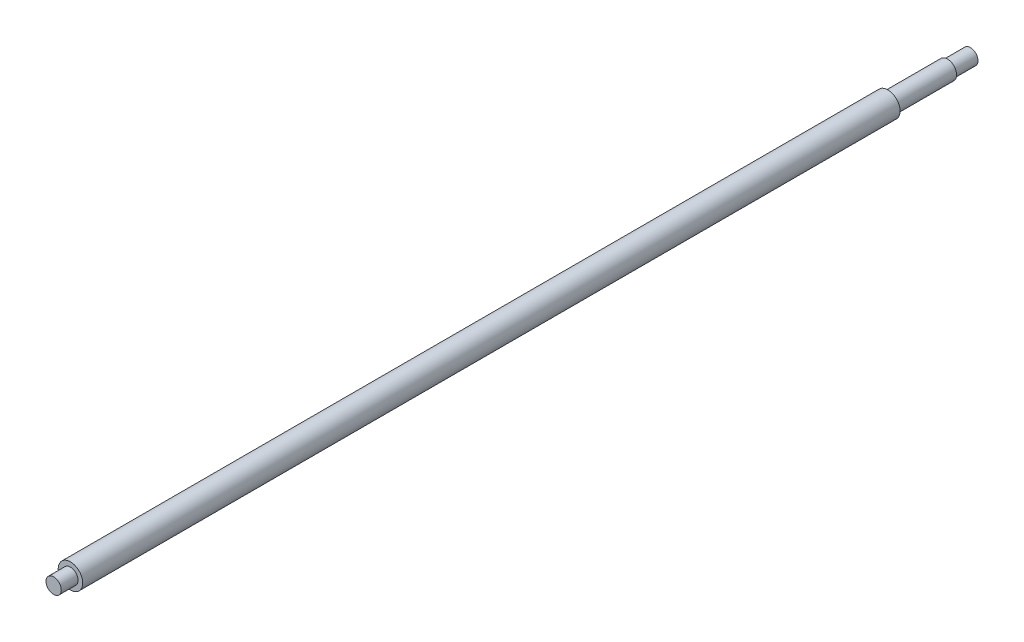
ISO-10303-21;
HEADER;
FILE_DESCRIPTION(('STEP AP214'),'2;1');
FILE_NAME('part.step','',(''),(''),'','','');
FILE_SCHEMA(('AUTOMOTIVE_DESIGN { 1 0 10303 214 1 1 1 1 }'));
ENDSEC;
DATA;
#1=APPLICATION_CONTEXT('core data for automotive mechanical design processes');
#2=APPLICATION_PROTOCOL_DEFINITION('international standard','automotive_design',2000,#1);
#3=PRODUCT_CONTEXT('',#1,'mechanical');
#4=PRODUCT('Part','Part','',(#3));
#5=PRODUCT_RELATED_PRODUCT_CATEGORY('part','',(#4));
#6=PRODUCT_DEFINITION_FORMATION('','',#4);
#7=PRODUCT_DEFINITION_CONTEXT('part definition',#1,'design');
#8=PRODUCT_DEFINITION('design','',#6,#7);
#9=PRODUCT_DEFINITION_SHAPE('','',#8);
#10=(LENGTH_UNIT() NAMED_UNIT(*) SI_UNIT(.MILLI.,.METRE.));
#11=(NAMED_UNIT(*) PLANE_ANGLE_UNIT() SI_UNIT($,.RADIAN.));
#12=(NAMED_UNIT(*) SI_UNIT($,.STERADIAN.) SOLID_ANGLE_UNIT());
#13=UNCERTAINTY_MEASURE_WITH_UNIT(LENGTH_MEASURE(1.E-05),#10,'distance_accuracy_value','');
#14=(GEOMETRIC_REPRESENTATION_CONTEXT(3) GLOBAL_UNCERTAINTY_ASSIGNED_CONTEXT((#13)) GLOBAL_UNIT_ASSIGNED_CONTEXT((#10,
#11,#12)) REPRESENTATION_CONTEXT('',''));
#15=CARTESIAN_POINT('',(0.,0.,0.));
#16=DIRECTION('',(0.,0.,1.));
#17=DIRECTION('',(1.,0.,0.));
#18=AXIS2_PLACEMENT_3D('',#15,#16,#17);
#19=CARTESIAN_POINT('',(0.,0.,15.));
#20=DIRECTION('',(0.,0.,-1.));
#21=DIRECTION('',(-1.,0.,0.));
#22=AXIS2_PLACEMENT_3D('',#19,#20,#21);
#23=CYLINDRICAL_SURFACE('',#22,5.);
#24=CARTESIAN_POINT('',(0.,0.,15.));
#25=DIRECTION('',(0.,0.,1.));
#26=DIRECTION('',(1.,0.,0.));
#27=AXIS2_PLACEMENT_3D('',#24,#25,#26);
#28=CIRCLE('',#27,5.);
#29=CARTESIAN_POINT('',(5.,0.,15.));
#30=VERTEX_POINT('',#29);
#31=EDGE_CURVE('E47',#30,#30,#28,.T.);
#32=ORIENTED_EDGE('',*,*,#31,.F.);
#33=EDGE_LOOP('',(#32));
#34=FACE_BOUND('',#33,.T.);
#35=CARTESIAN_POINT('',(0.,0.,0.));
#36=DIRECTION('',(0.,0.,1.));
#37=DIRECTION('',(1.,0.,0.));
#38=AXIS2_PLACEMENT_3D('',#35,#36,#37);
#39=CIRCLE('',#38,5.);
#40=CARTESIAN_POINT('',(5.,0.,0.));
#41=VERTEX_POINT('',#40);
#42=EDGE_CURVE('E42',#41,#41,#39,.T.);
#43=ORIENTED_EDGE('',*,*,#42,.T.);
#44=EDGE_LOOP('',(#43));
#45=FACE_BOUND('',#44,.T.);
#46=ADVANCED_FACE('F39',(#34,#45),#23,.T.);
#47=CARTESIAN_POINT('',(0.,0.,0.));
#48=DIRECTION('',(0.,0.,1.));
#49=DIRECTION('',(1.,0.,0.));
#50=AXIS2_PLACEMENT_3D('',#47,#48,#49);
#51=PLANE('',#50);
#52=ORIENTED_EDGE('',*,*,#42,.F.);
#53=EDGE_LOOP('',(#52));
#54=FACE_BOUND('',#53,.T.);
#55=ADVANCED_FACE('F87',(#54),#51,.F.);
#56=CARTESIAN_POINT('',(0.,0.,54.));
#57=DIRECTION('',(0.,0.,-1.));
#58=DIRECTION('',(-1.,0.,0.));
#59=AXIS2_PLACEMENT_3D('',#56,#57,#58);
#60=CYLINDRICAL_SURFACE('',#59,6.);
#61=CARTESIAN_POINT('',(0.,0.,54.));
#62=DIRECTION('',(0.,0.,1.));
#63=DIRECTION('',(1.,0.,0.));
#64=AXIS2_PLACEMENT_3D('',#61,#62,#63);
#65=CIRCLE('',#64,6.);
#66=CARTESIAN_POINT('',(6.,0.,54.));
#67=VERTEX_POINT('',#66);
#68=EDGE_CURVE('E65',#67,#67,#65,.T.);
#69=ORIENTED_EDGE('',*,*,#68,.F.);
#70=EDGE_LOOP('',(#69));
#71=FACE_BOUND('',#70,.T.);
#72=CARTESIAN_POINT('',(0.,0.,15.));
#73=DIRECTION('',(0.,0.,1.));
#74=DIRECTION('',(1.,0.,0.));
#75=AXIS2_PLACEMENT_3D('',#72,#73,#74);
#76=CIRCLE('',#75,6.);
#77=CARTESIAN_POINT('',(6.,0.,15.));
#78=VERTEX_POINT('',#77);
#79=EDGE_CURVE('E60',#78,#78,#76,.T.);
#80=ORIENTED_EDGE('',*,*,#79,.T.);
#81=EDGE_LOOP('',(#80));
#82=FACE_BOUND('',#81,.T.);
#83=ADVANCED_FACE('F73',(#71,#82),#60,.T.);
#84=CARTESIAN_POINT('',(0.,0.,15.));
#85=DIRECTION('',(0.,0.,1.));
#86=DIRECTION('',(1.,0.,0.));
#87=AXIS2_PLACEMENT_3D('',#84,#85,#86);
#88=PLANE('',#87);
#89=ORIENTED_EDGE('',*,*,#31,.T.);
#90=EDGE_LOOP('',(#89));
#91=FACE_BOUND('',#90,.T.);
#92=ORIENTED_EDGE('',*,*,#79,.F.);
#93=EDGE_LOOP('',(#92));
#94=FACE_BOUND('',#93,.T.);
#95=ADVANCED_FACE('F75',(#91,#94),#88,.F.);
#96=CARTESIAN_POINT('',(0.,0.,589.));
#97=DIRECTION('',(0.,0.,-1.));
#98=DIRECTION('',(-1.,0.,0.));
#99=AXIS2_PLACEMENT_3D('',#96,#97,#98);
#100=CYLINDRICAL_SURFACE('',#99,8.);
#101=CARTESIAN_POINT('',(0.,0.,589.));
#102=DIRECTION('',(0.,0.,1.));
#103=DIRECTION('',(1.,0.,0.));
#104=AXIS2_PLACEMENT_3D('',#101,#102,#103);
#105=CIRCLE('',#104,8.);
#106=CARTESIAN_POINT('',(8.,0.,589.));
#107=VERTEX_POINT('',#106);
#108=EDGE_CURVE('E56',#107,#107,#105,.T.);
#109=ORIENTED_EDGE('',*,*,#108,.F.);
#110=EDGE_LOOP('',(#109));
#111=FACE_BOUND('',#110,.T.);
#112=CARTESIAN_POINT('',(0.,0.,54.));
#113=DIRECTION('',(0.,0.,1.));
#114=DIRECTION('',(1.,0.,0.));
#115=AXIS2_PLACEMENT_3D('',#112,#113,#114);
#116=CIRCLE('',#115,8.);
#117=CARTESIAN_POINT('',(8.,0.,54.));
#118=VERTEX_POINT('',#117);
#119=EDGE_CURVE('E61',#118,#118,#116,.T.);
#120=ORIENTED_EDGE('',*,*,#119,.T.);
#121=EDGE_LOOP('',(#120));
#122=FACE_BOUND('',#121,.T.);
#123=ADVANCED_FACE('F77',(#111,#122),#100,.T.);
#124=CARTESIAN_POINT('',(0.,0.,589.));
#125=DIRECTION('',(0.,0.,1.));
#126=DIRECTION('',(1.,0.,0.));
#127=AXIS2_PLACEMENT_3D('',#124,#125,#126);
#128=PLANE('',#127);
#129=CARTESIAN_POINT('',(0.,0.,589.));
#130=DIRECTION('',(0.,0.,1.));
#131=DIRECTION('',(1.,0.,0.));
#132=AXIS2_PLACEMENT_3D('',#129,#130,#131);
#133=CIRCLE('',#132,5.);
#134=CARTESIAN_POINT('',(5.,0.,589.));
#135=VERTEX_POINT('',#134);
#136=EDGE_CURVE('E10',#135,#135,#133,.T.);
#137=ORIENTED_EDGE('',*,*,#136,.F.);
#138=EDGE_LOOP('',(#137));
#139=FACE_BOUND('',#138,.T.);
#140=ORIENTED_EDGE('',*,*,#108,.T.);
#141=EDGE_LOOP('',(#140));
#142=FACE_BOUND('',#141,.T.);
#143=ADVANCED_FACE('F84',(#139,#142),#128,.T.);
#144=CARTESIAN_POINT('',(0.,0.,54.));
#145=DIRECTION('',(0.,0.,1.));
#146=DIRECTION('',(1.,0.,0.));
#147=AXIS2_PLACEMENT_3D('',#144,#145,#146);
#148=PLANE('',#147);
#149=ORIENTED_EDGE('',*,*,#68,.T.);
#150=EDGE_LOOP('',(#149));
#151=FACE_BOUND('',#150,.T.);
#152=ORIENTED_EDGE('',*,*,#119,.F.);
#153=EDGE_LOOP('',(#152));
#154=FACE_BOUND('',#153,.T.);
#155=ADVANCED_FACE('F124',(#151,#154),#148,.F.);
#156=CARTESIAN_POINT('',(0.,0.,600.));
#157=DIRECTION('',(0.,0.,-1.));
#158=DIRECTION('',(-1.,0.,0.));
#159=AXIS2_PLACEMENT_3D('',#156,#157,#158);
#160=CYLINDRICAL_SURFACE('',#159,5.);
#161=CARTESIAN_POINT('',(0.,0.,600.));
#162=DIRECTION('',(0.,0.,1.));
#163=DIRECTION('',(1.,0.,0.));
#164=AXIS2_PLACEMENT_3D('',#161,#162,#163);
#165=CIRCLE('',#164,5.);
#166=CARTESIAN_POINT('',(5.,0.,600.));
#167=VERTEX_POINT('',#166);
#168=EDGE_CURVE('E55',#167,#167,#165,.T.);
#169=ORIENTED_EDGE('',*,*,#168,.F.);
#170=EDGE_LOOP('',(#169));
#171=FACE_BOUND('',#170,.T.);
#172=ORIENTED_EDGE('',*,*,#136,.T.);
#173=EDGE_LOOP('',(#172));
#174=FACE_BOUND('',#173,.T.);
#175=ADVANCED_FACE('F129',(#171,#174),#160,.T.);
#176=CARTESIAN_POINT('',(0.,0.,600.));
#177=DIRECTION('',(0.,0.,1.));
#178=DIRECTION('',(1.,0.,0.));
#179=AXIS2_PLACEMENT_3D('',#176,#177,#178);
#180=PLANE('',#179);
#181=ORIENTED_EDGE('',*,*,#168,.T.);
#182=EDGE_LOOP('',(#181));
#183=FACE_BOUND('',#182,.T.);
#184=ADVANCED_FACE('F146',(#183),#180,.T.);
#185=CLOSED_SHELL('',(#46,#55,#83,#95,#123,#143,#155,#175,#184));
#186=MANIFOLD_SOLID_BREP('B2',#185);
#187=ADVANCED_BREP_SHAPE_REPRESENTATION('',(#18,#186),#14);
#188=SHAPE_DEFINITION_REPRESENTATION(#9,#187);
ENDSEC;
END-ISO-10303-21;
